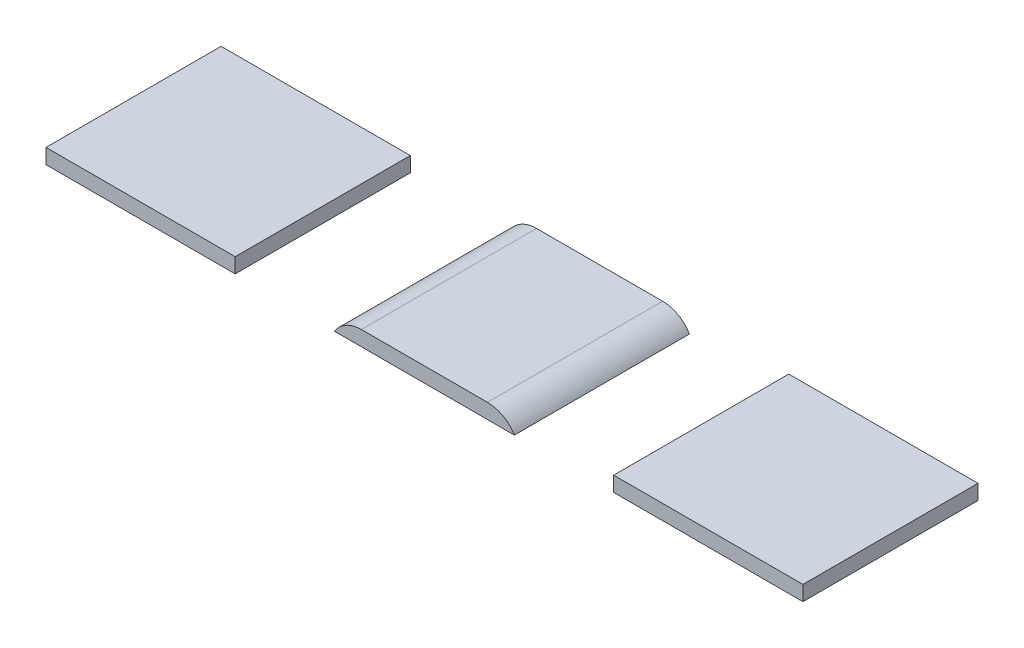
ISO-10303-21;
HEADER;
FILE_DESCRIPTION(('STEP AP214'),'2;1');
FILE_NAME('part.step','',(''),(''),'','','');
FILE_SCHEMA(('AUTOMOTIVE_DESIGN { 1 0 10303 214 1 1 1 1 }'));
ENDSEC;
DATA;
#1=APPLICATION_CONTEXT('core data for automotive mechanical design processes');
#2=APPLICATION_PROTOCOL_DEFINITION('international standard','automotive_design',2000,#1);
#3=PRODUCT_CONTEXT('',#1,'mechanical');
#4=PRODUCT('Part','Part','',(#3));
#5=PRODUCT_RELATED_PRODUCT_CATEGORY('part','',(#4));
#6=PRODUCT_DEFINITION_FORMATION('','',#4);
#7=PRODUCT_DEFINITION_CONTEXT('part definition',#1,'design');
#8=PRODUCT_DEFINITION('design','',#6,#7);
#9=PRODUCT_DEFINITION_SHAPE('','',#8);
#10=(LENGTH_UNIT() NAMED_UNIT(*) SI_UNIT(.MILLI.,.METRE.));
#11=(NAMED_UNIT(*) PLANE_ANGLE_UNIT() SI_UNIT($,.RADIAN.));
#12=(NAMED_UNIT(*) SI_UNIT($,.STERADIAN.) SOLID_ANGLE_UNIT());
#13=UNCERTAINTY_MEASURE_WITH_UNIT(LENGTH_MEASURE(1.E-05),#10,'distance_accuracy_value','');
#14=(GEOMETRIC_REPRESENTATION_CONTEXT(3) GLOBAL_UNCERTAINTY_ASSIGNED_CONTEXT((#13)) GLOBAL_UNIT_ASSIGNED_CONTEXT((#10,
#11,#12)) REPRESENTATION_CONTEXT('',''));
#15=CARTESIAN_POINT('',(0.,0.,0.));
#16=DIRECTION('',(0.,0.,1.));
#17=DIRECTION('',(1.,0.,0.));
#18=AXIS2_PLACEMENT_3D('',#15,#16,#17);
#19=CARTESIAN_POINT('',(1.253306532419,1.650056147,1.5));
#20=DIRECTION('',(0.,0.,-1.));
#21=DIRECTION('',(0.,-1.,0.));
#22=AXIS2_PLACEMENT_3D('',#19,#20,#21);
#23=PLANE('',#22);
#24=DIRECTION('',(-1.,0.,0.));
#25=VECTOR('',#24,1.);
#26=CARTESIAN_POINT('',(1.275,1.547467559748,1.5));
#27=LINE('',#26,#25);
#28=CARTESIAN_POINT('',(-0.6,1.5474675603,1.500000000063));
#29=VERTEX_POINT('',#28);
#30=CARTESIAN_POINT('',(-1.199999999667,1.547467559826,1.5));
#31=VERTEX_POINT('',#30);
#32=EDGE_CURVE('P0_E76',#29,#31,#27,.T.);
#33=ORIENTED_EDGE('',*,*,#32,.F.);
#34=DIRECTION('',(0.,1.,0.));
#35=VECTOR('',#34,1.);
#36=CARTESIAN_POINT('',(-0.6,1.060000000201,1.500000000063));
#37=LINE('',#36,#35);
#38=CARTESIAN_POINT('',(-0.6,1.5,1.500000000063));
#39=VERTEX_POINT('',#38);
#40=EDGE_CURVE('P0_E101',#39,#29,#37,.T.);
#41=ORIENTED_EDGE('',*,*,#40,.F.);
#42=DIRECTION('',(-1.,0.,0.));
#43=VECTOR('',#42,1.);
#44=CARTESIAN_POINT('',(-0.09834673379054,1.5,1.5));
#45=LINE('',#44,#43);
#46=CARTESIAN_POINT('',(-1.1999999995,1.5,1.5));
#47=VERTEX_POINT('',#46);
#48=EDGE_CURVE('P0_E11',#39,#47,#45,.T.);
#49=ORIENTED_EDGE('',*,*,#48,.T.);
#50=DIRECTION('',(0.,-1.,0.));
#51=VECTOR('',#50,1.);
#52=CARTESIAN_POINT('',(-1.1999999995,1.06,1.5));
#53=LINE('',#52,#51);
#54=EDGE_CURVE('P0_E113',#31,#47,#53,.T.);
#55=ORIENTED_EDGE('',*,*,#54,.F.);
#56=EDGE_LOOP('',(#33,#41,#49,#55));
#57=FACE_BOUND('',#56,.T.);
#58=ADVANCED_FACE('P0_F16',(#57),#23,.T.);
#59=CARTESIAN_POINT('',(-1.45,1.5,-1.475774862966));
#60=DIRECTION('',(0.,1.,0.));
#61=DIRECTION('',(1.,0.,0.));
#62=AXIS2_PLACEMENT_3D('',#59,#60,#61);
#63=PLANE('',#62);
#64=ORIENTED_EDGE('',*,*,#48,.F.);
#65=DIRECTION('',(0.,0.,1.));
#66=VECTOR('',#65,1.);
#67=CARTESIAN_POINT('',(-0.6,1.5,1.005278002348));
#68=LINE('',#67,#66);
#69=CARTESIAN_POINT('',(-0.6,1.5,2.055212715181));
#70=VERTEX_POINT('',#69);
#71=EDGE_CURVE('P0_E95',#39,#70,#68,.T.);
#72=ORIENTED_EDGE('',*,*,#71,.T.);
#73=DIRECTION('',(1.,0.,0.));
#74=VECTOR('',#73,1.);
#75=CARTESIAN_POINT('',(-2.583667995049,1.5,2.055212715181));
#76=LINE('',#75,#74);
#77=CARTESIAN_POINT('',(-1.2,1.5,2.055212715181));
#78=VERTEX_POINT('',#77);
#79=EDGE_CURVE('P0_E27',#78,#70,#76,.T.);
#80=ORIENTED_EDGE('',*,*,#79,.F.);
#81=DIRECTION('',(0.,0.,-1.));
#82=VECTOR('',#81,1.);
#83=CARTESIAN_POINT('',(-1.2,1.5,0.630278002348));
#84=LINE('',#83,#82);
#85=EDGE_CURVE('P0_E116',#78,#47,#84,.T.);
#86=ORIENTED_EDGE('',*,*,#85,.T.);
#87=EDGE_LOOP('',(#64,#72,#80,#86));
#88=FACE_BOUND('',#87,.T.);
#89=ADVANCED_FACE('P0_F99',(#88),#63,.F.);
#90=CARTESIAN_POINT('',(-2.583667995049,1.5,2.055212715181));
#91=DIRECTION('',(0.,0.,1.));
#92=DIRECTION('',(1.,0.,0.));
#93=AXIS2_PLACEMENT_3D('',#90,#91,#92);
#94=PLANE('',#93);
#95=DIRECTION('',(0.,1.,0.));
#96=VECTOR('',#95,1.);
#97=CARTESIAN_POINT('',(-0.6,1.52373378015,2.055212715181));
#98=LINE('',#97,#96);
#99=CARTESIAN_POINT('',(-0.6,1.5474675603,2.055212715181));
#100=VERTEX_POINT('',#99);
#101=EDGE_CURVE('P0_E82',#70,#100,#98,.T.);
#102=ORIENTED_EDGE('',*,*,#101,.T.);
#103=DIRECTION('',(-1.,0.,0.));
#104=VECTOR('',#103,1.);
#105=CARTESIAN_POINT('',(-0.991833997525,1.54746756,2.055212715181));
#106=LINE('',#105,#104);
#107=CARTESIAN_POINT('',(-1.2,1.54746756015,2.055212715181));
#108=VERTEX_POINT('',#107);
#109=EDGE_CURVE('P0_E61',#100,#108,#106,.T.);
#110=ORIENTED_EDGE('',*,*,#109,.T.);
#111=DIRECTION('',(0.,-1.,0.));
#112=VECTOR('',#111,1.);
#113=CARTESIAN_POINT('',(-1.2,0.87373378,2.055212715181));
#114=LINE('',#113,#112);
#115=EDGE_CURVE('P0_E85',#108,#78,#114,.T.);
#116=ORIENTED_EDGE('',*,*,#115,.T.);
#117=ORIENTED_EDGE('',*,*,#79,.T.);
#118=EDGE_LOOP('',(#102,#110,#116,#117));
#119=FACE_BOUND('',#118,.T.);
#120=ADVANCED_FACE('P0_F81',(#119),#94,.T.);
#121=CARTESIAN_POINT('',(0.6,1.54746756,2.25));
#122=DIRECTION('',(0.,1.,0.));
#123=DIRECTION('',(1.,0.,0.));
#124=AXIS2_PLACEMENT_3D('',#121,#122,#123);
#125=PLANE('',#124);
#126=ORIENTED_EDGE('',*,*,#109,.F.);
#127=DIRECTION('',(0.,0.,1.));
#128=VECTOR('',#127,1.);
#129=CARTESIAN_POINT('',(-0.6,1.5474675603,1.500000000063));
#130=LINE('',#129,#128);
#131=EDGE_CURVE('P0_E96',#29,#100,#130,.T.);
#132=ORIENTED_EDGE('',*,*,#131,.F.);
#133=ORIENTED_EDGE('',*,*,#32,.T.);
#134=DIRECTION('',(0.,0.,-1.));
#135=VECTOR('',#134,1.);
#136=CARTESIAN_POINT('',(-1.2,1.54746756015,1.5));
#137=LINE('',#136,#135);
#138=EDGE_CURVE('P0_E20',#108,#31,#137,.T.);
#139=ORIENTED_EDGE('',*,*,#138,.F.);
#140=EDGE_LOOP('',(#126,#132,#133,#139));
#141=FACE_BOUND('',#140,.T.);
#142=ADVANCED_FACE('P0_F18',(#141),#125,.T.);
#143=CARTESIAN_POINT('',(-1.2,0.24746756,1.5));
#144=DIRECTION('',(-1.,0.,0.));
#145=DIRECTION('',(0.,0.,1.));
#146=AXIS2_PLACEMENT_3D('',#143,#144,#145);
#147=PLANE('',#146);
#148=ORIENTED_EDGE('',*,*,#115,.F.);
#149=ORIENTED_EDGE('',*,*,#138,.T.);
#150=ORIENTED_EDGE('',*,*,#54,.T.);
#151=ORIENTED_EDGE('',*,*,#85,.F.);
#152=EDGE_LOOP('',(#148,#149,#150,#151));
#153=FACE_BOUND('',#152,.T.);
#154=ADVANCED_FACE('P0_F127',(#153),#147,.T.);
#155=CARTESIAN_POINT('',(-0.6,1.5474675603,2.25));
#156=DIRECTION('',(1.,0.,0.));
#157=DIRECTION('',(0.,1.,0.));
#158=AXIS2_PLACEMENT_3D('',#155,#156,#157);
#159=PLANE('',#158);
#160=ORIENTED_EDGE('',*,*,#71,.F.);
#161=ORIENTED_EDGE('',*,*,#40,.T.);
#162=ORIENTED_EDGE('',*,*,#131,.T.);
#163=ORIENTED_EDGE('',*,*,#101,.F.);
#164=EDGE_LOOP('',(#160,#161,#162,#163));
#165=FACE_BOUND('',#164,.T.);
#166=ADVANCED_FACE('P0_F93',(#165),#159,.T.);
#167=CLOSED_SHELL('',(#58,#89,#120,#142,#154,#166));
#168=MANIFOLD_SOLID_BREP('P0_B1',#167);
#169=CARTESIAN_POINT('',(1.253306532419,1.650056147,1.5));
#170=DIRECTION('',(0.,0.,-1.));
#171=DIRECTION('',(0.,-1.,0.));
#172=AXIS2_PLACEMENT_3D('',#169,#170,#171);
#173=PLANE('',#172);
#174=DIRECTION('',(-1.,0.,0.));
#175=VECTOR('',#174,1.);
#176=CARTESIAN_POINT('',(-0.09834673379054,1.5,1.5));
#177=LINE('',#176,#175);
#178=CARTESIAN_POINT('',(1.19999999925,1.5,1.5));
#179=VERTEX_POINT('',#178);
#180=CARTESIAN_POINT('',(0.6000000003,1.5,1.499999999987));
#181=VERTEX_POINT('',#180);
#182=EDGE_CURVE('P1_E11',#179,#181,#177,.T.);
#183=ORIENTED_EDGE('',*,*,#182,.T.);
#184=DIRECTION('',(0.,-1.,0.));
#185=VECTOR('',#184,1.);
#186=CARTESIAN_POINT('',(0.6000000003,1.547467559953,1.499999999987));
#187=LINE('',#186,#185);
#188=CARTESIAN_POINT('',(0.6000000003,1.547467559953,1.499999999987));
#189=VERTEX_POINT('',#188);
#190=EDGE_CURVE('P1_E20',#189,#181,#187,.T.);
#191=ORIENTED_EDGE('',*,*,#190,.F.);
#192=DIRECTION('',(-1.,0.,0.));
#193=VECTOR('',#192,1.);
#194=CARTESIAN_POINT('',(1.275,1.547467559748,1.5));
#195=LINE('',#194,#193);
#196=CARTESIAN_POINT('',(1.199999999887,1.547467559811,1.5));
#197=VERTEX_POINT('',#196);
#198=EDGE_CURVE('P1_E98',#197,#189,#195,.T.);
#199=ORIENTED_EDGE('',*,*,#198,.F.);
#200=DIRECTION('',(0.,1.,0.));
#201=VECTOR('',#200,1.);
#202=CARTESIAN_POINT('',(1.19999999925,1.06,1.5));
#203=LINE('',#202,#201);
#204=EDGE_CURVE('P1_E87',#179,#197,#203,.T.);
#205=ORIENTED_EDGE('',*,*,#204,.F.);
#206=EDGE_LOOP('',(#183,#191,#199,#205));
#207=FACE_BOUND('',#206,.T.);
#208=ADVANCED_FACE('P1_F16',(#207),#173,.T.);
#209=CARTESIAN_POINT('',(-1.45,1.5,-1.475774862966));
#210=DIRECTION('',(0.,1.,0.));
#211=DIRECTION('',(1.,0.,0.));
#212=AXIS2_PLACEMENT_3D('',#209,#210,#211);
#213=PLANE('',#212);
#214=ORIENTED_EDGE('',*,*,#182,.F.);
#215=DIRECTION('',(0.,0.,1.));
#216=VECTOR('',#215,1.);
#217=CARTESIAN_POINT('',(1.2,1.5,1.005278002348));
#218=LINE('',#217,#216);
#219=CARTESIAN_POINT('',(1.2,1.5,2.055212715181));
#220=VERTEX_POINT('',#219);
#221=EDGE_CURVE('P1_E83',#179,#220,#218,.T.);
#222=ORIENTED_EDGE('',*,*,#221,.T.);
#223=DIRECTION('',(1.,0.,0.));
#224=VECTOR('',#223,1.);
#225=CARTESIAN_POINT('',(-2.583667995049,1.5,2.055212715181));
#226=LINE('',#225,#224);
#227=CARTESIAN_POINT('',(0.6000000003,1.5,2.055212715181));
#228=VERTEX_POINT('',#227);
#229=EDGE_CURVE('P1_E27',#228,#220,#226,.T.);
#230=ORIENTED_EDGE('',*,*,#229,.F.);
#231=DIRECTION('',(0.,0.,-1.));
#232=VECTOR('',#231,1.);
#233=CARTESIAN_POINT('',(0.6000000003,1.5,0.755278002347));
#234=LINE('',#233,#232);
#235=EDGE_CURVE('P1_E102',#228,#181,#234,.T.);
#236=ORIENTED_EDGE('',*,*,#235,.T.);
#237=EDGE_LOOP('',(#214,#222,#230,#236));
#238=FACE_BOUND('',#237,.T.);
#239=ADVANCED_FACE('P1_F18',(#238),#213,.F.);
#240=CARTESIAN_POINT('',(-2.583667995049,1.5,2.055212715181));
#241=DIRECTION('',(0.,0.,1.));
#242=DIRECTION('',(1.,0.,0.));
#243=AXIS2_PLACEMENT_3D('',#240,#241,#242);
#244=PLANE('',#243);
#245=DIRECTION('',(0.,-1.,0.));
#246=VECTOR('',#245,1.);
#247=CARTESIAN_POINT('',(0.6000000003,1.280000000133,2.055212715181));
#248=LINE('',#247,#246);
#249=CARTESIAN_POINT('',(0.6000000003,1.547467559953,2.055212715181));
#250=VERTEX_POINT('',#249);
#251=EDGE_CURVE('P1_E76',#250,#228,#248,.T.);
#252=ORIENTED_EDGE('',*,*,#251,.T.);
#253=ORIENTED_EDGE('',*,*,#229,.T.);
#254=DIRECTION('',(0.,1.,0.));
#255=VECTOR('',#254,1.);
#256=CARTESIAN_POINT('',(1.2,0.87373378,2.055212715181));
#257=LINE('',#256,#255);
#258=CARTESIAN_POINT('',(1.2000000003,1.54746756,2.055212715181));
#259=VERTEX_POINT('',#258);
#260=EDGE_CURVE('P1_E74',#220,#259,#257,.T.);
#261=ORIENTED_EDGE('',*,*,#260,.T.);
#262=DIRECTION('',(-1.,0.,0.));
#263=VECTOR('',#262,1.);
#264=CARTESIAN_POINT('',(-0.991833997525,1.54746756,2.055212715181));
#265=LINE('',#264,#263);
#266=EDGE_CURVE('P1_E61',#259,#250,#265,.T.);
#267=ORIENTED_EDGE('',*,*,#266,.T.);
#268=EDGE_LOOP('',(#252,#253,#261,#267));
#269=FACE_BOUND('',#268,.T.);
#270=ADVANCED_FACE('P1_F72',(#269),#244,.T.);
#271=CARTESIAN_POINT('',(0.6000000003,1.060000000266,1.749999999999));
#272=DIRECTION('',(1.,0.,0.));
#273=DIRECTION('',(0.,1.,0.));
#274=AXIS2_PLACEMENT_3D('',#271,#272,#273);
#275=PLANE('',#274);
#276=ORIENTED_EDGE('',*,*,#235,.F.);
#277=ORIENTED_EDGE('',*,*,#251,.F.);
#278=DIRECTION('',(0.,0.,-1.));
#279=VECTOR('',#278,1.);
#280=CARTESIAN_POINT('',(0.6000000003,1.547467559953,2.249999999987));
#281=LINE('',#280,#279);
#282=EDGE_CURVE('P1_E99',#250,#189,#281,.T.);
#283=ORIENTED_EDGE('',*,*,#282,.T.);
#284=ORIENTED_EDGE('',*,*,#190,.T.);
#285=EDGE_LOOP('',(#276,#277,#283,#284));
#286=FACE_BOUND('',#285,.T.);
#287=ADVANCED_FACE('P1_F121',(#286),#275,.F.);
#288=CARTESIAN_POINT('',(0.6,1.54746756,2.25));
#289=DIRECTION('',(0.,1.,0.));
#290=DIRECTION('',(1.,0.,0.));
#291=AXIS2_PLACEMENT_3D('',#288,#289,#290);
#292=PLANE('',#291);
#293=ORIENTED_EDGE('',*,*,#266,.F.);
#294=DIRECTION('',(0.,0.,-1.));
#295=VECTOR('',#294,1.);
#296=CARTESIAN_POINT('',(1.2000000003,1.54746756,2.25));
#297=LINE('',#296,#295);
#298=EDGE_CURVE('P1_E90',#259,#197,#297,.T.);
#299=ORIENTED_EDGE('',*,*,#298,.T.);
#300=ORIENTED_EDGE('',*,*,#198,.T.);
#301=ORIENTED_EDGE('',*,*,#282,.F.);
#302=EDGE_LOOP('',(#293,#299,#300,#301));
#303=FACE_BOUND('',#302,.T.);
#304=ADVANCED_FACE('P1_F169',(#303),#292,.T.);
#305=CARTESIAN_POINT('',(1.2,0.24746756,2.25));
#306=DIRECTION('',(1.,0.,0.));
#307=DIRECTION('',(0.,1.,0.));
#308=AXIS2_PLACEMENT_3D('',#305,#306,#307);
#309=PLANE('',#308);
#310=ORIENTED_EDGE('',*,*,#260,.F.);
#311=ORIENTED_EDGE('',*,*,#221,.F.);
#312=ORIENTED_EDGE('',*,*,#204,.T.);
#313=ORIENTED_EDGE('',*,*,#298,.F.);
#314=EDGE_LOOP('',(#310,#311,#312,#313));
#315=FACE_BOUND('',#314,.T.);
#316=ADVANCED_FACE('P1_F89',(#315),#309,.T.);
#317=CLOSED_SHELL('',(#208,#239,#270,#287,#304,#316));
#318=MANIFOLD_SOLID_BREP('P1_B1',#317);
#319=CARTESIAN_POINT('',(-0.200000000774,1.447467560774,2.25));
#320=DIRECTION('',(0.,0.,-1.));
#321=DIRECTION('',(-1.,0.,0.));
#322=AXIS2_PLACEMENT_3D('',#319,#320,#321);
#323=CYLINDRICAL_SURFACE('',#322,0.09999999922649);
#324=CARTESIAN_POINT('',(-0.200000000774,1.447467560774,2.055212715181));
#325=DIRECTION('',(0.,0.,1.));
#326=DIRECTION('',(-1.,0.,0.));
#327=AXIS2_PLACEMENT_3D('',#324,#325,#326);
#328=CIRCLE('',#327,0.09999999922649);
#329=CARTESIAN_POINT('',(-0.200000000774,1.54746756,2.055212715181));
#330=VERTEX_POINT('',#329);
#331=CARTESIAN_POINT('',(-0.285090203936,1.5,2.055212715181));
#332=VERTEX_POINT('',#331);
#333=EDGE_CURVE('P2_E75',#330,#332,#328,.T.);
#334=ORIENTED_EDGE('',*,*,#333,.F.);
#335=DIRECTION('',(0.,0.,1.));
#336=VECTOR('',#335,1.);
#337=CARTESIAN_POINT('',(-0.200000000774,1.54746756,2.25));
#338=LINE('',#337,#336);
#339=CARTESIAN_POINT('',(-0.200000000774,1.547467559748,1.5));
#340=VERTEX_POINT('',#339);
#341=EDGE_CURVE('P2_E11',#340,#330,#338,.T.);
#342=ORIENTED_EDGE('',*,*,#341,.F.);
#343=CARTESIAN_POINT('',(-0.200000000774,1.447467560774,1.5));
#344=DIRECTION('',(0.,0.,-1.));
#345=DIRECTION('',(-1.,0.,0.));
#346=AXIS2_PLACEMENT_3D('',#343,#344,#345);
#347=CIRCLE('',#346,0.09999999922649);
#348=CARTESIAN_POINT('',(-0.285090203936,1.5,1.5));
#349=VERTEX_POINT('',#348);
#350=EDGE_CURVE('P2_E87',#349,#340,#347,.T.);
#351=ORIENTED_EDGE('',*,*,#350,.F.);
#352=DIRECTION('',(0.,0.,-1.));
#353=VECTOR('',#352,1.);
#354=CARTESIAN_POINT('',(-0.285090203936,1.5,2.25));
#355=LINE('',#354,#353);
#356=EDGE_CURVE('P2_E85',#332,#349,#355,.T.);
#357=ORIENTED_EDGE('',*,*,#356,.F.);
#358=EDGE_LOOP('',(#334,#342,#351,#357));
#359=FACE_BOUND('',#358,.T.);
#360=ADVANCED_FACE('P2_F16',(#359),#323,.T.);
#361=CARTESIAN_POINT('',(0.6,1.54746756,2.25));
#362=DIRECTION('',(0.,1.,0.));
#363=DIRECTION('',(1.,0.,0.));
#364=AXIS2_PLACEMENT_3D('',#361,#362,#363);
#365=PLANE('',#364);
#366=DIRECTION('',(-1.,0.,0.));
#367=VECTOR('',#366,1.);
#368=CARTESIAN_POINT('',(-0.991833997525,1.54746756,2.055212715181));
#369=LINE('',#368,#367);
#370=CARTESIAN_POINT('',(0.200000000774,1.54746756,2.055212715181));
#371=VERTEX_POINT('',#370);
#372=EDGE_CURVE('P2_E20',#371,#330,#369,.T.);
#373=ORIENTED_EDGE('',*,*,#372,.F.);
#374=DIRECTION('',(0.,0.,-1.));
#375=VECTOR('',#374,1.);
#376=CARTESIAN_POINT('',(0.200000000774,1.54746756,2.25));
#377=LINE('',#376,#375);
#378=CARTESIAN_POINT('',(0.200000000774,1.547467559748,1.5));
#379=VERTEX_POINT('',#378);
#380=EDGE_CURVE('P2_E27',#371,#379,#377,.T.);
#381=ORIENTED_EDGE('',*,*,#380,.T.);
#382=DIRECTION('',(-1.,0.,0.));
#383=VECTOR('',#382,1.);
#384=CARTESIAN_POINT('',(1.275,1.547467559748,1.5));
#385=LINE('',#384,#383);
#386=EDGE_CURVE('P2_E107',#379,#340,#385,.T.);
#387=ORIENTED_EDGE('',*,*,#386,.T.);
#388=ORIENTED_EDGE('',*,*,#341,.T.);
#389=EDGE_LOOP('',(#373,#381,#387,#388));
#390=FACE_BOUND('',#389,.T.);
#391=ADVANCED_FACE('P2_F18',(#390),#365,.T.);
#392=CARTESIAN_POINT('',(0.200000000774,1.447467560774,2.25));
#393=DIRECTION('',(0.,0.,-1.));
#394=DIRECTION('',(-1.,0.,0.));
#395=AXIS2_PLACEMENT_3D('',#392,#393,#394);
#396=CYLINDRICAL_SURFACE('',#395,0.09999999922649);
#397=CARTESIAN_POINT('',(0.200000000774,1.447467560774,2.055212715181));
#398=DIRECTION('',(0.,0.,1.));
#399=DIRECTION('',(-1.,0.,0.));
#400=AXIS2_PLACEMENT_3D('',#397,#398,#399);
#401=CIRCLE('',#400,0.09999999922649);
#402=CARTESIAN_POINT('',(0.285090203936,1.5,2.055212715181));
#403=VERTEX_POINT('',#402);
#404=EDGE_CURVE('P2_E66',#403,#371,#401,.T.);
#405=ORIENTED_EDGE('',*,*,#404,.F.);
#406=DIRECTION('',(0.,0.,1.));
#407=VECTOR('',#406,1.);
#408=CARTESIAN_POINT('',(0.285090203936,1.5,2.25));
#409=LINE('',#408,#407);
#410=CARTESIAN_POINT('',(0.285090203936,1.5,1.5));
#411=VERTEX_POINT('',#410);
#412=EDGE_CURVE('P2_E94',#411,#403,#409,.T.);
#413=ORIENTED_EDGE('',*,*,#412,.F.);
#414=CARTESIAN_POINT('',(0.200000000774,1.447467560774,1.5));
#415=DIRECTION('',(0.,0.,-1.));
#416=DIRECTION('',(-1.,0.,0.));
#417=AXIS2_PLACEMENT_3D('',#414,#415,#416);
#418=CIRCLE('',#417,0.09999999922649);
#419=EDGE_CURVE('P2_E100',#379,#411,#418,.T.);
#420=ORIENTED_EDGE('',*,*,#419,.F.);
#421=ORIENTED_EDGE('',*,*,#380,.F.);
#422=EDGE_LOOP('',(#405,#413,#420,#421));
#423=FACE_BOUND('',#422,.T.);
#424=ADVANCED_FACE('P2_F123',(#423),#396,.T.);
#425=CARTESIAN_POINT('',(-2.583667995049,1.5,2.055212715181));
#426=DIRECTION('',(0.,0.,1.));
#427=DIRECTION('',(1.,0.,0.));
#428=AXIS2_PLACEMENT_3D('',#425,#426,#427);
#429=PLANE('',#428);
#430=ORIENTED_EDGE('',*,*,#404,.T.);
#431=ORIENTED_EDGE('',*,*,#372,.T.);
#432=ORIENTED_EDGE('',*,*,#333,.T.);
#433=DIRECTION('',(1.,0.,0.));
#434=VECTOR('',#433,1.);
#435=CARTESIAN_POINT('',(-2.583667995049,1.5,2.055212715181));
#436=LINE('',#435,#434);
#437=EDGE_CURVE('P2_E79',#332,#403,#436,.T.);
#438=ORIENTED_EDGE('',*,*,#437,.T.);
#439=EDGE_LOOP('',(#430,#431,#432,#438));
#440=FACE_BOUND('',#439,.T.);
#441=ADVANCED_FACE('P2_F77',(#440),#429,.T.);
#442=CARTESIAN_POINT('',(-1.45,1.5,-1.475774862966));
#443=DIRECTION('',(0.,1.,0.));
#444=DIRECTION('',(1.,0.,0.));
#445=AXIS2_PLACEMENT_3D('',#442,#443,#444);
#446=PLANE('',#445);
#447=DIRECTION('',(-1.,0.,0.));
#448=VECTOR('',#447,1.);
#449=CARTESIAN_POINT('',(-0.09834673379054,1.5,1.5));
#450=LINE('',#449,#448);
#451=EDGE_CURVE('P2_E115',#411,#349,#450,.T.);
#452=ORIENTED_EDGE('',*,*,#451,.F.);
#453=ORIENTED_EDGE('',*,*,#412,.T.);
#454=ORIENTED_EDGE('',*,*,#437,.F.);
#455=ORIENTED_EDGE('',*,*,#356,.T.);
#456=EDGE_LOOP('',(#452,#453,#454,#455));
#457=FACE_BOUND('',#456,.T.);
#458=ADVANCED_FACE('P2_F93',(#457),#446,.F.);
#459=CARTESIAN_POINT('',(1.253306532419,1.650056147,1.5));
#460=DIRECTION('',(0.,0.,-1.));
#461=DIRECTION('',(0.,-1.,0.));
#462=AXIS2_PLACEMENT_3D('',#459,#460,#461);
#463=PLANE('',#462);
#464=ORIENTED_EDGE('',*,*,#451,.T.);
#465=ORIENTED_EDGE('',*,*,#350,.T.);
#466=ORIENTED_EDGE('',*,*,#386,.F.);
#467=ORIENTED_EDGE('',*,*,#419,.T.);
#468=EDGE_LOOP('',(#464,#465,#466,#467));
#469=FACE_BOUND('',#468,.T.);
#470=ADVANCED_FACE('P2_F120',(#469),#463,.T.);
#471=CLOSED_SHELL('',(#360,#391,#424,#441,#458,#470));
#472=MANIFOLD_SOLID_BREP('P2_B1',#471);
#473=ADVANCED_BREP_SHAPE_REPRESENTATION('',(#18,#168,#318,#472),#14);
#474=SHAPE_DEFINITION_REPRESENTATION(#9,#473);
ENDSEC;
END-ISO-10303-21;
